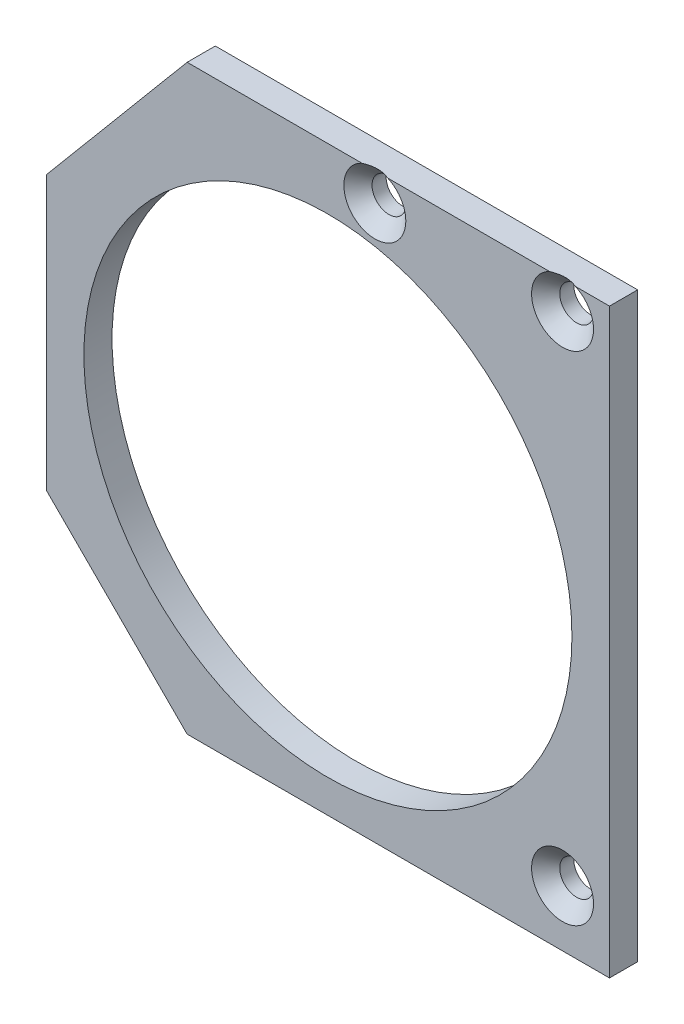
ISO-10303-21;
HEADER;
FILE_DESCRIPTION(('STEP AP214'),'2;1');
FILE_NAME('part.step','',(''),(''),'','','');
FILE_SCHEMA(('AUTOMOTIVE_DESIGN { 1 0 10303 214 1 1 1 1 }'));
ENDSEC;
DATA;
#1=APPLICATION_CONTEXT('core data for automotive mechanical design processes');
#2=APPLICATION_PROTOCOL_DEFINITION('international standard','automotive_design',2000,#1);
#3=PRODUCT_CONTEXT('',#1,'mechanical');
#4=PRODUCT('Part','Part','',(#3));
#5=PRODUCT_RELATED_PRODUCT_CATEGORY('part','',(#4));
#6=PRODUCT_DEFINITION_FORMATION('','',#4);
#7=PRODUCT_DEFINITION_CONTEXT('part definition',#1,'design');
#8=PRODUCT_DEFINITION('design','',#6,#7);
#9=PRODUCT_DEFINITION_SHAPE('','',#8);
#10=(LENGTH_UNIT() NAMED_UNIT(*) SI_UNIT(.MILLI.,.METRE.));
#11=(NAMED_UNIT(*) PLANE_ANGLE_UNIT() SI_UNIT($,.RADIAN.));
#12=(NAMED_UNIT(*) SI_UNIT($,.STERADIAN.) SOLID_ANGLE_UNIT());
#13=UNCERTAINTY_MEASURE_WITH_UNIT(LENGTH_MEASURE(1.E-05),#10,'distance_accuracy_value','');
#14=(GEOMETRIC_REPRESENTATION_CONTEXT(3) GLOBAL_UNCERTAINTY_ASSIGNED_CONTEXT((#13)) GLOBAL_UNIT_ASSIGNED_CONTEXT((#10,
#11,#12)) REPRESENTATION_CONTEXT('',''));
#15=CARTESIAN_POINT('',(0.,0.,0.));
#16=DIRECTION('',(0.,0.,1.));
#17=DIRECTION('',(1.,0.,0.));
#18=AXIS2_PLACEMENT_3D('',#15,#16,#17);
#19=CARTESIAN_POINT('',(0.,0.,3.));
#20=DIRECTION('',(0.,0.,1.));
#21=DIRECTION('',(1.,0.,0.));
#22=AXIS2_PLACEMENT_3D('',#19,#20,#21);
#23=PLANE('',#22);
#24=CARTESIAN_POINT('',(5.,28.,3.));
#25=DIRECTION('',(0.,0.,1.));
#26=DIRECTION('',(1.,0.,0.));
#27=AXIS2_PLACEMENT_3D('',#24,#25,#26);
#28=CIRCLE('',#27,3.3);
#29=CARTESIAN_POINT('',(3.62522729151325,31.,3.));
#30=VERTEX_POINT('',#29);
#31=CARTESIAN_POINT('',(6.37477270848674,31.,3.));
#32=VERTEX_POINT('',#31);
#33=EDGE_CURVE('E54',#30,#32,#28,.T.);
#34=ORIENTED_EDGE('',*,*,#33,.F.);
#35=DIRECTION('',(-1.,0.,0.));
#36=VECTOR('',#35,1.);
#37=CARTESIAN_POINT('',(-30.,31.,3.));
#38=LINE('',#37,#36);
#39=CARTESIAN_POINT('',(-15.,31.,3.));
#40=VERTEX_POINT('',#39);
#41=EDGE_CURVE('E109',#30,#40,#38,.T.);
#42=ORIENTED_EDGE('',*,*,#41,.T.);
#43=DIRECTION('',(0.642787609686543,0.766044443118975,0.));
#44=VECTOR('',#43,1.);
#45=CARTESIAN_POINT('',(-30.,13.123696111087,3.));
#46=LINE('',#45,#44);
#47=CARTESIAN_POINT('',(-30.,13.123696111087,3.));
#48=VERTEX_POINT('',#47);
#49=EDGE_CURVE('E226',#48,#40,#46,.T.);
#50=ORIENTED_EDGE('',*,*,#49,.F.);
#51=DIRECTION('',(0.,-1.,0.));
#52=VECTOR('',#51,1.);
#53=CARTESIAN_POINT('',(-30.,31.,3.));
#54=LINE('',#53,#52);
#55=CARTESIAN_POINT('',(-30.,-16.,3.));
#56=VERTEX_POINT('',#55);
#57=EDGE_CURVE('E126',#48,#56,#54,.T.);
#58=ORIENTED_EDGE('',*,*,#57,.T.);
#59=DIRECTION('',(-0.707106781186548,0.707106781186547,0.));
#60=VECTOR('',#59,1.);
#61=CARTESIAN_POINT('',(-30.,-16.,3.));
#62=LINE('',#61,#60);
#63=CARTESIAN_POINT('',(-15.,-31.,3.));
#64=VERTEX_POINT('',#63);
#65=EDGE_CURVE('E215',#64,#56,#62,.T.);
#66=ORIENTED_EDGE('',*,*,#65,.F.);
#67=DIRECTION('',(1.,0.,0.));
#68=VECTOR('',#67,1.);
#69=CARTESIAN_POINT('',(-30.,-31.,3.));
#70=LINE('',#69,#68);
#71=CARTESIAN_POINT('',(30.,-31.,3.));
#72=VERTEX_POINT('',#71);
#73=EDGE_CURVE('E128',#64,#72,#70,.T.);
#74=ORIENTED_EDGE('',*,*,#73,.T.);
#75=DIRECTION('',(0.,1.,0.));
#76=VECTOR('',#75,1.);
#77=CARTESIAN_POINT('',(30.,31.,3.));
#78=LINE('',#77,#76);
#79=CARTESIAN_POINT('',(30.,31.,3.));
#80=VERTEX_POINT('',#79);
#81=EDGE_CURVE('E118',#72,#80,#78,.T.);
#82=ORIENTED_EDGE('',*,*,#81,.T.);
#83=CARTESIAN_POINT('',(26.3747727084867,31.,3.));
#84=VERTEX_POINT('',#83);
#85=EDGE_CURVE('E120',#80,#84,#38,.T.);
#86=ORIENTED_EDGE('',*,*,#85,.T.);
#87=CARTESIAN_POINT('',(25.,28.,3.));
#88=DIRECTION('',(0.,0.,1.));
#89=DIRECTION('',(1.,0.,0.));
#90=AXIS2_PLACEMENT_3D('',#87,#88,#89);
#91=CIRCLE('',#90,3.3);
#92=CARTESIAN_POINT('',(23.6252272915132,31.,3.));
#93=VERTEX_POINT('',#92);
#94=EDGE_CURVE('E60',#93,#84,#91,.T.);
#95=ORIENTED_EDGE('',*,*,#94,.F.);
#96=EDGE_CURVE('E111',#93,#32,#38,.T.);
#97=ORIENTED_EDGE('',*,*,#96,.T.);
#98=EDGE_LOOP('',(#34,#42,#50,#58,#66,#74,#82,#86,#95,#97));
#99=FACE_BOUND('',#98,.T.);
#100=CARTESIAN_POINT('',(25.,-25.,3.));
#101=DIRECTION('',(0.,0.,1.));
#102=DIRECTION('',(1.,0.,0.));
#103=AXIS2_PLACEMENT_3D('',#100,#101,#102);
#104=CIRCLE('',#103,3.3);
#105=CARTESIAN_POINT('',(28.3,-25.,3.));
#106=VERTEX_POINT('',#105);
#107=EDGE_CURVE('E257',#106,#106,#104,.T.);
#108=ORIENTED_EDGE('',*,*,#107,.F.);
#109=EDGE_LOOP('',(#108));
#110=FACE_BOUND('',#109,.T.);
#111=CARTESIAN_POINT('',(0.,-1.49999999999999,3.));
#112=DIRECTION('',(0.,0.,1.));
#113=DIRECTION('',(1.,0.,0.));
#114=AXIS2_PLACEMENT_3D('',#111,#112,#113);
#115=CIRCLE('',#114,26.);
#116=CARTESIAN_POINT('',(26.,-1.49999999999999,3.));
#117=VERTEX_POINT('',#116);
#118=EDGE_CURVE('E138',#117,#117,#115,.T.);
#119=ORIENTED_EDGE('',*,*,#118,.F.);
#120=EDGE_LOOP('',(#119));
#121=FACE_BOUND('',#120,.T.);
#122=ADVANCED_FACE('F35',(#99,#110,#121),#23,.T.);
#123=CARTESIAN_POINT('',(0.,0.,0.));
#124=DIRECTION('',(0.,0.,1.));
#125=DIRECTION('',(1.,0.,0.));
#126=AXIS2_PLACEMENT_3D('',#123,#124,#125);
#127=PLANE('',#126);
#128=CARTESIAN_POINT('',(5.,28.,0.));
#129=DIRECTION('',(0.,0.,1.));
#130=DIRECTION('',(1.,0.,0.));
#131=AXIS2_PLACEMENT_3D('',#128,#129,#130);
#132=CIRCLE('',#131,1.79999999999999);
#133=CARTESIAN_POINT('',(6.79999999999998,28.,0.));
#134=VERTEX_POINT('',#133);
#135=EDGE_CURVE('E246',#134,#134,#132,.T.);
#136=ORIENTED_EDGE('',*,*,#135,.T.);
#137=EDGE_LOOP('',(#136));
#138=FACE_BOUND('',#137,.T.);
#139=CARTESIAN_POINT('',(25.,28.,0.));
#140=DIRECTION('',(0.,0.,1.));
#141=DIRECTION('',(1.,0.,0.));
#142=AXIS2_PLACEMENT_3D('',#139,#140,#141);
#143=CIRCLE('',#142,1.79999999999999);
#144=CARTESIAN_POINT('',(26.8,28.,0.));
#145=VERTEX_POINT('',#144);
#146=EDGE_CURVE('E249',#145,#145,#143,.T.);
#147=ORIENTED_EDGE('',*,*,#146,.T.);
#148=EDGE_LOOP('',(#147));
#149=FACE_BOUND('',#148,.T.);
#150=CARTESIAN_POINT('',(25.,-25.,0.));
#151=DIRECTION('',(0.,0.,1.));
#152=DIRECTION('',(1.,0.,0.));
#153=AXIS2_PLACEMENT_3D('',#150,#151,#152);
#154=CIRCLE('',#153,1.79999999999999);
#155=CARTESIAN_POINT('',(26.8,-25.,0.));
#156=VERTEX_POINT('',#155);
#157=EDGE_CURVE('E216',#156,#156,#154,.T.);
#158=ORIENTED_EDGE('',*,*,#157,.T.);
#159=EDGE_LOOP('',(#158));
#160=FACE_BOUND('',#159,.T.);
#161=DIRECTION('',(1.,0.,0.));
#162=VECTOR('',#161,1.);
#163=CARTESIAN_POINT('',(-30.,-31.,0.));
#164=LINE('',#163,#162);
#165=CARTESIAN_POINT('',(-15.,-31.,0.));
#166=VERTEX_POINT('',#165);
#167=CARTESIAN_POINT('',(30.,-31.,0.));
#168=VERTEX_POINT('',#167);
#169=EDGE_CURVE('E122',#166,#168,#164,.T.);
#170=ORIENTED_EDGE('',*,*,#169,.F.);
#171=DIRECTION('',(0.707106781186548,-0.707106781186547,0.));
#172=VECTOR('',#171,1.);
#173=CARTESIAN_POINT('',(-30.,-16.,0.));
#174=LINE('',#173,#172);
#175=CARTESIAN_POINT('',(-30.,-16.,0.));
#176=VERTEX_POINT('',#175);
#177=EDGE_CURVE('E212',#176,#166,#174,.T.);
#178=ORIENTED_EDGE('',*,*,#177,.F.);
#179=DIRECTION('',(0.,-1.,0.));
#180=VECTOR('',#179,1.);
#181=CARTESIAN_POINT('',(-30.,31.,0.));
#182=LINE('',#181,#180);
#183=CARTESIAN_POINT('',(-30.,13.1236961110871,0.));
#184=VERTEX_POINT('',#183);
#185=EDGE_CURVE('E140',#184,#176,#182,.T.);
#186=ORIENTED_EDGE('',*,*,#185,.F.);
#187=DIRECTION('',(0.642787609686543,0.766044443118975,0.));
#188=VECTOR('',#187,1.);
#189=CARTESIAN_POINT('',(-30.,13.123696111087,0.));
#190=LINE('',#189,#188);
#191=CARTESIAN_POINT('',(-15.,31.,0.));
#192=VERTEX_POINT('',#191);
#193=EDGE_CURVE('E211',#184,#192,#190,.T.);
#194=ORIENTED_EDGE('',*,*,#193,.T.);
#195=DIRECTION('',(-1.,0.,0.));
#196=VECTOR('',#195,1.);
#197=CARTESIAN_POINT('',(-30.,31.,0.));
#198=LINE('',#197,#196);
#199=CARTESIAN_POINT('',(30.,31.,0.));
#200=VERTEX_POINT('',#199);
#201=EDGE_CURVE('E137',#200,#192,#198,.T.);
#202=ORIENTED_EDGE('',*,*,#201,.F.);
#203=DIRECTION('',(0.,1.,0.));
#204=VECTOR('',#203,1.);
#205=CARTESIAN_POINT('',(30.,31.,0.));
#206=LINE('',#205,#204);
#207=EDGE_CURVE('E134',#168,#200,#206,.T.);
#208=ORIENTED_EDGE('',*,*,#207,.F.);
#209=EDGE_LOOP('',(#170,#178,#186,#194,#202,#208));
#210=FACE_BOUND('',#209,.T.);
#211=CARTESIAN_POINT('',(0.,-1.49999999999999,0.));
#212=DIRECTION('',(0.,0.,1.));
#213=DIRECTION('',(1.,0.,0.));
#214=AXIS2_PLACEMENT_3D('',#211,#212,#213);
#215=CIRCLE('',#214,26.);
#216=CARTESIAN_POINT('',(26.,-1.49999999999999,0.));
#217=VERTEX_POINT('',#216);
#218=EDGE_CURVE('E231',#217,#217,#215,.T.);
#219=ORIENTED_EDGE('',*,*,#218,.T.);
#220=EDGE_LOOP('',(#219));
#221=FACE_BOUND('',#220,.T.);
#222=ADVANCED_FACE('F189',(#138,#149,#160,#210,#221),#127,.F.);
#223=CARTESIAN_POINT('',(30.,31.,3.));
#224=DIRECTION('',(-1.,0.,0.));
#225=DIRECTION('',(0.,-1.,0.));
#226=AXIS2_PLACEMENT_3D('',#223,#224,#225);
#227=PLANE('',#226);
#228=ORIENTED_EDGE('',*,*,#207,.T.);
#229=DIRECTION('',(0.,0.,-1.));
#230=VECTOR('',#229,1.);
#231=CARTESIAN_POINT('',(30.,31.,3.));
#232=LINE('',#231,#230);
#233=EDGE_CURVE('E146',#80,#200,#232,.T.);
#234=ORIENTED_EDGE('',*,*,#233,.F.);
#235=ORIENTED_EDGE('',*,*,#81,.F.);
#236=DIRECTION('',(0.,0.,-1.));
#237=VECTOR('',#236,1.);
#238=CARTESIAN_POINT('',(30.,-31.,3.));
#239=LINE('',#238,#237);
#240=EDGE_CURVE('E131',#72,#168,#239,.T.);
#241=ORIENTED_EDGE('',*,*,#240,.T.);
#242=EDGE_LOOP('',(#228,#234,#235,#241));
#243=FACE_BOUND('',#242,.T.);
#244=ADVANCED_FACE('F37',(#243),#227,.F.);
#245=CARTESIAN_POINT('',(-30.,31.,3.));
#246=DIRECTION('',(0.,-1.,0.));
#247=DIRECTION('',(1.,0.,0.));
#248=AXIS2_PLACEMENT_3D('',#245,#246,#247);
#249=PLANE('',#248);
#250=ORIENTED_EDGE('',*,*,#41,.F.);
#251=CARTESIAN_POINT('',(-6.45285562091003,31.,11.5392525893069));
#252=CARTESIAN_POINT('',(-6.15275280096645,31.,11.2489705564499));
#253=CARTESIAN_POINT('',(-5.85230826613524,31.,10.9590402435186));
#254=CARTESIAN_POINT('',(-5.25046594745898,31.,10.3801274588995));
#255=CARTESIAN_POINT('',(-4.94906809641479,31.,10.0911450570927));
#256=CARTESIAN_POINT('',(-4.34411816871667,31.,9.51348402377807));
#257=CARTESIAN_POINT('',(-4.0405622790841,31.,9.22480938090818));
#258=CARTESIAN_POINT('',(-3.43189572732243,31.,8.64913954129913));
#259=CARTESIAN_POINT('',(-3.12678515838647,31.,8.36214424605875));
#260=CARTESIAN_POINT('',(-2.47604575622062,31.,7.75455733783873));
#261=CARTESIAN_POINT('',(-2.13013481535182,31.,7.43426682781041));
#262=CARTESIAN_POINT('',(-1.60827810880776,31.,6.9570276335175));
#263=CARTESIAN_POINT('',(-1.43380929737719,31.,6.79846443498906));
#264=CARTESIAN_POINT('',(-1.08364581976484,31.,6.48269843451918));
#265=CARTESIAN_POINT('',(-0.907951163454536,31.,6.32549562164562));
#266=CARTESIAN_POINT('',(-0.555350550124874,31.,6.01310114000117));
#267=CARTESIAN_POINT('',(-0.378447376350146,31.,5.85790633422817));
#268=CARTESIAN_POINT('',(-0.0227042299990999,31.,5.54975600019851));
#269=CARTESIAN_POINT('',(0.156135693454553,31.,5.39680041537781));
#270=CARTESIAN_POINT('',(0.516269211865739,31.,5.09391778739342));
#271=CARTESIAN_POINT('',(0.697561999084173,31.,4.94398978590895));
#272=CARTESIAN_POINT('',(1.06344020965596,31.,4.64821726682396));
#273=CARTESIAN_POINT('',(1.24802527339892,31.,4.50237230765669));
#274=CARTESIAN_POINT('',(1.52972989454971,31.,4.2868370848864));
#275=CARTESIAN_POINT('',(1.62519589360843,31.,4.21498623668784));
#276=CARTESIAN_POINT('',(1.81748884817212,31.,4.07311723883915));
#277=CARTESIAN_POINT('',(1.91431584877888,31.,4.00309915014535));
#278=CARTESIAN_POINT('',(2.10969565735157,31.,3.86522054567184));
#279=CARTESIAN_POINT('',(2.2082506281213,31.,3.79736308534592));
#280=CARTESIAN_POINT('',(2.4072398057213,31.,3.66445701107809));
#281=CARTESIAN_POINT('',(2.50767394876529,31.,3.59940830204345));
#282=CARTESIAN_POINT('',(2.70917466453786,31.,3.47382672056162));
#283=CARTESIAN_POINT('',(2.81020708872216,31.,3.41323933653267));
#284=CARTESIAN_POINT('',(3.01478569658213,31.,3.29639028753415));
#285=CARTESIAN_POINT('',(3.11833233536457,31.,3.24012941351836));
#286=CARTESIAN_POINT('',(3.32804567184936,31.,3.13326497029052));
#287=CARTESIAN_POINT('',(3.43420618126775,31.,3.08264936291488));
#288=CARTESIAN_POINT('',(3.64959428416185,31.,2.98849894263039));
#289=CARTESIAN_POINT('',(3.75882005280797,31.,2.94496001742076));
#290=CARTESIAN_POINT('',(3.96288386636742,31.,2.87301162910838));
#291=CARTESIAN_POINT('',(4.05725814357774,31.,2.84329792728081));
#292=CARTESIAN_POINT('',(4.24808850573965,31.,2.79143141529014));
#293=CARTESIAN_POINT('',(4.34454447022943,31.,2.76927816886395));
#294=CARTESIAN_POINT('',(4.53849244850556,31.,2.73380351853377));
#295=CARTESIAN_POINT('',(4.63597471657368,31.,2.72042969873719));
#296=CARTESIAN_POINT('',(4.83178132564498,31.,2.70313101140363));
#297=CARTESIAN_POINT('',(4.93010558051452,31.,2.69920518867395));
#298=CARTESIAN_POINT('',(5.12387789015899,31.,2.70103703197444));
#299=CARTESIAN_POINT('',(5.21932865604651,31.,2.70652401622056));
#300=CARTESIAN_POINT('',(5.40930119294473,31.,2.72631739444189));
#301=CARTESIAN_POINT('',(5.5038229086731,31.,2.74062431005036));
#302=CARTESIAN_POINT('',(5.69182904947561,31.,2.77734783887106));
#303=CARTESIAN_POINT('',(5.78530412552614,31.,2.79981157488035));
#304=CARTESIAN_POINT('',(5.97026650730137,31.,2.85175048939282));
#305=CARTESIAN_POINT('',(6.06175362698041,31.,2.88122632107479));
#306=CARTESIAN_POINT('',(6.25293509576115,31.,2.94976812217862));
#307=CARTESIAN_POINT('',(6.35237221303947,31.,2.98954517684306));
#308=CARTESIAN_POINT('',(6.54868558191355,31.,3.07499804277696));
#309=CARTESIAN_POINT('',(6.64556099817013,31.,3.12067575028482));
#310=CARTESIAN_POINT('',(6.83709403208135,31.,3.21682279310862));
#311=CARTESIAN_POINT('',(6.93174755246815,31.,3.26730022772952));
#312=CARTESIAN_POINT('',(7.11891063104755,31.,3.37202513575827));
#313=CARTESIAN_POINT('',(7.21142055098155,31.,3.42627196679478));
#314=CARTESIAN_POINT('',(7.39581663375493,31.,3.53855675187773));
#315=CARTESIAN_POINT('',(7.48767754889119,31.,3.59663597502819));
#316=CARTESIAN_POINT('',(7.66974969537282,31.,3.71532053259731));
#317=CARTESIAN_POINT('',(7.75996088316641,31.,3.77592593356741));
#318=CARTESIAN_POINT('',(7.93886696188889,31.,3.89913532308982));
#319=CARTESIAN_POINT('',(8.02756331764609,31.,3.96173719079936));
#320=CARTESIAN_POINT('',(8.20372561564267,31.,4.08863631341683));
#321=CARTESIAN_POINT('',(8.29119161263785,31.,4.15293349250833));
#322=CARTESIAN_POINT('',(8.49205855628277,31.,4.3031228892681));
#323=CARTESIAN_POINT('',(8.60508027357718,31.,4.3895218387513));
#324=CARTESIAN_POINT('',(8.82961696308996,31.,4.56425872194153));
#325=CARTESIAN_POINT('',(8.94113187319301,31.,4.65259673519131));
#326=CARTESIAN_POINT('',(9.27383218131246,31.,4.91997324078732));
#327=CARTESIAN_POINT('',(9.4931390107006,31.,5.10134830082653));
#328=CARTESIAN_POINT('',(9.92830108560637,31.,5.46841148085376));
#329=CARTESIAN_POINT('',(10.1441542950753,31.,5.65410199746505));
#330=CARTESIAN_POINT('',(10.5732323703512,31.,6.02850265024441));
#331=CARTESIAN_POINT('',(10.7864571564436,31.,6.21721287759717));
#332=CARTESIAN_POINT('',(11.2114439458873,31.,6.59731770915798));
#333=CARTESIAN_POINT('',(11.4232010412092,31.,6.78871778835942));
#334=CARTESIAN_POINT('',(11.8451760109497,31.,7.17321304512812));
#335=CARTESIAN_POINT('',(12.0553938557021,31.,7.36630825520907));
#336=CARTESIAN_POINT('',(12.6840972883393,31.,7.94739647461864));
#337=CARTESIAN_POINT('',(13.1007871228247,31.,8.33733123303791));
#338=CARTESIAN_POINT('',(13.8763539854604,31.,9.06886007099785));
#339=CARTESIAN_POINT('',(14.2356121269083,31.,9.41005159719586));
#340=CARTESIAN_POINT('',(14.9524747781457,31.,10.0942434429225));
#341=CARTESIAN_POINT('',(15.3100791074474,31.,10.4372439515201));
#342=CARTESIAN_POINT('',(16.0225070550545,31.,11.1230636357184));
#343=CARTESIAN_POINT('',(16.3773360198599,31.,11.4658772635853));
#344=CARTESIAN_POINT('',(17.0859904933709,31.,12.1524565146784));
#345=CARTESIAN_POINT('',(17.4398161159651,31.,12.4962220203226));
#346=CARTESIAN_POINT('',(17.7932987664917,31.,12.8403384023669));
#347=B_SPLINE_CURVE_WITH_KNOTS('',3,(#251,#252,#253,#254,#255,#256,#257,#258,#259,#260,#261,
#262,#263,#264,#265,#266,#267,#268,#269,#270,#271,#272,#273,#274,#275,#276,#277,#278,#279,#280,
#281,#282,#283,#284,#285,#286,#287,#288,#289,#290,#291,#292,#293,#294,#295,#296,#297,#298,#299,
#300,#301,#302,#303,#304,#305,#306,#307,#308,#309,#310,#311,#312,#313,#314,#315,#316,#317,#318,
#319,#320,#321,#322,#323,#324,#325,#326,#327,#328,#329,#330,#331,#332,#333,#334,#335,#336,#337,
#338,#339,#340,#341,#342,#343,#344,#345,#346),.UNSPECIFIED.,.F.,.F.,(4,2,2,2,2,2,2,2,2,2,2,2,2,
2,2,2,2,2,2,2,2,2,2,2,2,2,2,2,2,2,2,2,2,2,2,2,2,2,2,2,2,2,2,2,2,2,2,4),(0.,1.25256994649439,
2.50523024695386,3.76193233037848,5.01855994851695,6.43280252472181,7.14007007993828,
7.84733194623132,8.55330785474532,9.25926589901363,9.96499686827429,10.670651218038,
11.029084750072,11.3875301882533,11.7464618372692,12.1053813247965,12.4587168401826,
12.8121167980263,13.1647481321978,13.517173811928,13.8137361059115,14.1102812843827,
14.4050394936158,14.6997679015359,14.9861622488466,15.2725735358755,15.5606664843067,
15.8487862791968,16.169840107181,16.4909973671401,16.8127065212918,17.1343609843823,
17.4603543863033,17.7863563818625,18.112022902227,18.4376748830034,18.8644350633255,
19.2912127827006,20.1448967386463,20.9990666932001,21.8532624895523,22.7095661438049,
23.565886258547,25.2779030814586,26.7642696554903,28.2507947864948,29.7309357114445,
31.2109013016707),.UNSPECIFIED.);
#348=EDGE_CURVE('E11',#30,#32,#347,.T.);
#349=ORIENTED_EDGE('',*,*,#348,.T.);
#350=ORIENTED_EDGE('',*,*,#96,.F.);
#351=CARTESIAN_POINT('',(13.5471443722589,31.,11.539252595915));
#352=CARTESIAN_POINT('',(13.8472471924448,31.,11.2489705628125));
#353=CARTESIAN_POINT('',(14.1476917275184,31.,10.9590402496355));
#354=CARTESIAN_POINT('',(14.7495340466794,31.,10.3801274645251));
#355=CARTESIAN_POINT('',(15.050931897966,31.,10.0911450624727));
#356=CARTESIAN_POINT('',(15.6558818261502,31.,9.51348402866545));
#357=CARTESIAN_POINT('',(15.9594377160265,31.,9.22480938554867));
#358=CARTESIAN_POINT('',(16.5681042682759,31.,8.64913954544605));
#359=CARTESIAN_POINT('',(16.8732148374558,31.,8.36214424995901));
#360=CARTESIAN_POINT('',(17.5239542401619,31.,7.7545573411956));
#361=CARTESIAN_POINT('',(17.8698651813271,31.,7.4342668308708));
#362=CARTESIAN_POINT('',(18.3917218883177,31.,6.95702763613474));
#363=CARTESIAN_POINT('',(18.5661906998975,31.,6.79846443745881));
#364=CARTESIAN_POINT('',(18.916354177809,31.,6.48269843669481));
#365=CARTESIAN_POINT('',(19.0920488342694,31.,6.32549562367462));
#366=CARTESIAN_POINT('',(19.4446494479,31.,6.01310114173867));
#367=CARTESIAN_POINT('',(19.6215526218255,31.,5.8579063358208));
#368=CARTESIAN_POINT('',(19.9772957684802,31.,5.54975600150341));
#369=CARTESIAN_POINT('',(20.1561356920866,31.,5.39680041653985));
#370=CARTESIAN_POINT('',(20.5162692108061,31.,5.09391778827311));
#371=CARTESIAN_POINT('',(20.69756199818,31.,4.94398978664913));
#372=CARTESIAN_POINT('',(21.0634402090674,31.,4.64821726729043));
#373=CARTESIAN_POINT('',(21.2480252729704,31.,4.50237230798897));
#374=CARTESIAN_POINT('',(21.529729894284,31.,4.2868370850875));
#375=CARTESIAN_POINT('',(21.6251958933418,31.,4.21498623688721));
#376=CARTESIAN_POINT('',(21.8174888479034,31.,4.07311723903473));
#377=CARTESIAN_POINT('',(21.9143158485091,31.,4.00309915033888));
#378=CARTESIAN_POINT('',(22.1096956570793,31.,3.86522054586085));
#379=CARTESIAN_POINT('',(22.2082506278476,31.,3.79736308553246));
#380=CARTESIAN_POINT('',(22.4072398054446,31.,3.66445701125913));
#381=CARTESIAN_POINT('',(22.5076739484869,31.,3.59940830222146));
#382=CARTESIAN_POINT('',(22.7091746642564,31.,3.47382672073256));
#383=CARTESIAN_POINT('',(22.8102070884393,31.,3.41323933669961));
#384=CARTESIAN_POINT('',(23.0147856962961,31.,3.29639028769216));
#385=CARTESIAN_POINT('',(23.1183323350768,31.,3.24012941367145));
#386=CARTESIAN_POINT('',(23.3280456715579,31.,3.13326497043259));
#387=CARTESIAN_POINT('',(23.4342061809744,31.,3.08264936305083));
#388=CARTESIAN_POINT('',(23.6495942838645,31.,2.98849894275266));
#389=CARTESIAN_POINT('',(23.7588200525086,31.,2.94496001753545));
#390=CARTESIAN_POINT('',(23.9628838660424,31.,2.87301162921531));
#391=CARTESIAN_POINT('',(24.0572581432286,31.,2.8432979273863));
#392=CARTESIAN_POINT('',(24.2480885053417,31.,2.79143141538771));
#393=CARTESIAN_POINT('',(24.3445444698068,31.,2.76927816895503));
#394=CARTESIAN_POINT('',(24.5384924480344,31.,2.73380351860627));
#395=CARTESIAN_POINT('',(24.6359747160786,31.,2.72042969879766));
#396=CARTESIAN_POINT('',(24.8317813251032,31.,2.70313101143478));
#397=CARTESIAN_POINT('',(24.93010557995,31.,2.69920518868781));
#398=CARTESIAN_POINT('',(25.1238778895454,31.,2.70103703194998));
#399=CARTESIAN_POINT('',(25.2193286554067,31.,2.7065240161746));
#400=CARTESIAN_POINT('',(25.4093011922547,31.,2.72631739434928));
#401=CARTESIAN_POINT('',(25.5038229079591,31.,2.74062430993259));
#402=CARTESIAN_POINT('',(25.691829048715,31.,2.77734783870063));
#403=CARTESIAN_POINT('',(25.7853041247429,31.,2.79981157468235));
#404=CARTESIAN_POINT('',(25.9702665064749,31.,2.85175048913881));
#405=CARTESIAN_POINT('',(26.0617536261333,31.,2.88122632079235));
#406=CARTESIAN_POINT('',(26.2529350948154,31.,2.94976812181585));
#407=CARTESIAN_POINT('',(26.3523722120173,31.,2.98954517642428));
#408=CARTESIAN_POINT('',(26.5486855807423,31.,3.07499804224095));
#409=CARTESIAN_POINT('',(26.6455609969263,31.,3.12067574968757));
#410=CARTESIAN_POINT('',(26.837094030695,31.,3.2168227923855));
#411=CARTESIAN_POINT('',(26.9317475510119,31.,3.26730022694176));
#412=CARTESIAN_POINT('',(27.1189106294536,31.,3.37202513483932));
#413=CARTESIAN_POINT('',(27.2114205493199,31.,3.4262719658093));
#414=CARTESIAN_POINT('',(27.3958166319593,31.,3.53855675075762));
#415=CARTESIAN_POINT('',(27.4876775470293,31.,3.59663597384001));
#416=CARTESIAN_POINT('',(27.6697496933794,31.,3.71532053127241));
#417=CARTESIAN_POINT('',(27.7599608811078,31.,3.77592593217386));
#418=CARTESIAN_POINT('',(27.9388669597009,31.,3.89913532155885));
#419=CARTESIAN_POINT('',(28.0275633153938,31.,3.96173718919962));
#420=CARTESIAN_POINT('',(28.2037256132623,31.,4.08863631167946));
#421=CARTESIAN_POINT('',(28.2911916101937,31.,4.15293349070212));
#422=CARTESIAN_POINT('',(28.4920585538005,31.,4.30312288738416));
#423=CARTESIAN_POINT('',(28.6050802711188,31.,4.38952183686079));
#424=CARTESIAN_POINT('',(28.8296169606772,31.,4.56425872004136));
#425=CARTESIAN_POINT('',(28.9411318708019,31.,4.65259673328804));
#426=CARTESIAN_POINT('',(29.2738321789837,31.,4.91997323887873));
#427=CARTESIAN_POINT('',(29.4931390084098,31.,5.1013482989196));
#428=CARTESIAN_POINT('',(29.9283010833871,31.,5.46841147895655));
#429=CARTESIAN_POINT('',(30.1441542928897,31.,5.65410199557593));
#430=CARTESIAN_POINT('',(30.5732323682298,31.,6.02850264837536));
#431=CARTESIAN_POINT('',(30.7864571543526,31.,6.21721287574012));
#432=CARTESIAN_POINT('',(31.2114439438565,31.,6.59731770732852));
#433=CARTESIAN_POINT('',(31.4232010392079,31.,6.78871778654558));
#434=CARTESIAN_POINT('',(31.8451760090059,31.,7.17321304334732));
#435=CARTESIAN_POINT('',(32.0553938537864,31.,7.36630825344569));
#436=CARTESIAN_POINT('',(32.6840972865054,31.,7.9473964729089));
#437=CARTESIAN_POINT('',(33.1007871210431,31.,8.33733123136624));
#438=CARTESIAN_POINT('',(33.8763539837001,31.,9.06886006932993));
#439=CARTESIAN_POINT('',(34.2356121251178,31.,9.4100515954928));
#440=CARTESIAN_POINT('',(34.9524747762946,31.,10.0942434411499));
#441=CARTESIAN_POINT('',(35.3100791055656,31.,10.4372439497131));
#442=CARTESIAN_POINT('',(36.022507053108,31.,11.12306363384));
#443=CARTESIAN_POINT('',(36.3773360178791,31.,11.4658772616699));
#444=CARTESIAN_POINT('',(37.0859904913213,31.,12.1524565126892));
#445=CARTESIAN_POINT('',(37.4398161138809,31.,12.4962220182965));
#446=CARTESIAN_POINT('',(37.7932987643729,31.,12.840338400304));
#447=B_SPLINE_CURVE_WITH_KNOTS('',3,(#351,#352,#353,#354,#355,#356,#357,#358,#359,#360,#361,
#362,#363,#364,#365,#366,#367,#368,#369,#370,#371,#372,#373,#374,#375,#376,#377,#378,#379,#380,
#381,#382,#383,#384,#385,#386,#387,#388,#389,#390,#391,#392,#393,#394,#395,#396,#397,#398,#399,
#400,#401,#402,#403,#404,#405,#406,#407,#408,#409,#410,#411,#412,#413,#414,#415,#416,#417,#418,
#419,#420,#421,#422,#423,#424,#425,#426,#427,#428,#429,#430,#431,#432,#433,#434,#435,#436,#437,
#438,#439,#440,#441,#442,#443,#444,#445,#446),.UNSPECIFIED.,.F.,.F.,(4,2,2,2,2,2,2,2,2,2,2,2,2,
2,2,2,2,2,2,2,2,2,2,2,2,2,2,2,2,2,2,2,2,2,2,2,2,2,2,2,2,2,2,2,2,2,2,4),(0.,1.2525699475292,
2.50523024902365,3.76193233348859,5.01855995266719,6.43280253012897,7.14007008597422,
7.84733195289603,8.55330786203684,9.25926590693193,9.96499687681885,10.6706512272086,
11.0290847592436,11.3875301974258,11.7464618464424,12.1053813339706,12.4587168493592,
12.8121168072055,13.1647481413797,13.5171738211126,13.8137361150288,14.1102812934326,
14.4050395025999,14.6997679104541,14.9861622576828,15.2725735446295,15.5606664929755,
15.8487862877805,16.1698401154897,16.4909973751737,16.8127065290491,17.1343609918634,
17.4603543935072,17.7863563887892,18.1120229088771,18.4376748893771,18.8644350697442,
19.2912127891644,20.1448967452007,20.9990666998468,21.8532624962913,22.7095661506411,
23.5658862654804,25.2779030885844,26.764269662478,28.2507947933447,29.7309357181435,
31.2109013082183),.UNSPECIFIED.);
#448=EDGE_CURVE('E48',#93,#84,#447,.T.);
#449=ORIENTED_EDGE('',*,*,#448,.T.);
#450=ORIENTED_EDGE('',*,*,#85,.F.);
#451=ORIENTED_EDGE('',*,*,#233,.T.);
#452=ORIENTED_EDGE('',*,*,#201,.T.);
#453=DIRECTION('',(0.,0.,1.));
#454=VECTOR('',#453,1.);
#455=CARTESIAN_POINT('',(-15.,31.,0.));
#456=LINE('',#455,#454);
#457=EDGE_CURVE('E117',#192,#40,#456,.T.);
#458=ORIENTED_EDGE('',*,*,#457,.T.);
#459=EDGE_LOOP('',(#250,#349,#350,#449,#450,#451,#452,#458));
#460=FACE_BOUND('',#459,.T.);
#461=ADVANCED_FACE('F115',(#460),#249,.F.);
#462=CARTESIAN_POINT('',(-30.,31.,3.));
#463=DIRECTION('',(1.,0.,0.));
#464=DIRECTION('',(0.,1.,0.));
#465=AXIS2_PLACEMENT_3D('',#462,#463,#464);
#466=PLANE('',#465);
#467=ORIENTED_EDGE('',*,*,#185,.T.);
#468=DIRECTION('',(0.,0.,1.));
#469=VECTOR('',#468,1.);
#470=CARTESIAN_POINT('',(-30.,-16.,-0.00100000000000013));
#471=LINE('',#470,#469);
#472=EDGE_CURVE('E204',#176,#56,#471,.T.);
#473=ORIENTED_EDGE('',*,*,#472,.T.);
#474=ORIENTED_EDGE('',*,*,#57,.F.);
#475=DIRECTION('',(0.,0.,1.));
#476=VECTOR('',#475,1.);
#477=CARTESIAN_POINT('',(-30.,13.123696111087,0.));
#478=LINE('',#477,#476);
#479=EDGE_CURVE('E205',#184,#48,#478,.T.);
#480=ORIENTED_EDGE('',*,*,#479,.F.);
#481=EDGE_LOOP('',(#467,#473,#474,#480));
#482=FACE_BOUND('',#481,.T.);
#483=ADVANCED_FACE('F194',(#482),#466,.F.);
#484=CARTESIAN_POINT('',(-30.,-31.,3.));
#485=DIRECTION('',(0.,1.,0.));
#486=DIRECTION('',(-1.,0.,0.));
#487=AXIS2_PLACEMENT_3D('',#484,#485,#486);
#488=PLANE('',#487);
#489=ORIENTED_EDGE('',*,*,#73,.F.);
#490=DIRECTION('',(0.,0.,1.));
#491=VECTOR('',#490,1.);
#492=CARTESIAN_POINT('',(-15.,-31.,-0.00100000000000013));
#493=LINE('',#492,#491);
#494=EDGE_CURVE('E218',#166,#64,#493,.T.);
#495=ORIENTED_EDGE('',*,*,#494,.F.);
#496=ORIENTED_EDGE('',*,*,#169,.T.);
#497=ORIENTED_EDGE('',*,*,#240,.F.);
#498=EDGE_LOOP('',(#489,#495,#496,#497));
#499=FACE_BOUND('',#498,.T.);
#500=ADVANCED_FACE('F185',(#499),#488,.F.);
#501=CARTESIAN_POINT('',(0.,-1.49999999999999,3.));
#502=DIRECTION('',(0.,0.,-1.));
#503=DIRECTION('',(-1.,0.,0.));
#504=AXIS2_PLACEMENT_3D('',#501,#502,#503);
#505=CYLINDRICAL_SURFACE('',#504,26.);
#506=ORIENTED_EDGE('',*,*,#118,.T.);
#507=EDGE_LOOP('',(#506));
#508=FACE_BOUND('',#507,.T.);
#509=ORIENTED_EDGE('',*,*,#218,.F.);
#510=EDGE_LOOP('',(#509));
#511=FACE_BOUND('',#510,.T.);
#512=ADVANCED_FACE('F181',(#508,#511),#505,.F.);
#513=CARTESIAN_POINT('',(-30.,13.123696111087,0.));
#514=DIRECTION('',(0.766044443118975,-0.642787609686543,0.));
#515=DIRECTION('',(0.642787609686543,0.766044443118975,0.));
#516=AXIS2_PLACEMENT_3D('',#513,#514,#515);
#517=PLANE('',#516);
#518=ORIENTED_EDGE('',*,*,#49,.T.);
#519=ORIENTED_EDGE('',*,*,#457,.F.);
#520=ORIENTED_EDGE('',*,*,#193,.F.);
#521=ORIENTED_EDGE('',*,*,#479,.T.);
#522=EDGE_LOOP('',(#518,#519,#520,#521));
#523=FACE_BOUND('',#522,.T.);
#524=ADVANCED_FACE('F177',(#523),#517,.F.);
#525=CARTESIAN_POINT('',(-30.,-16.,-0.00100000000000013));
#526=DIRECTION('',(0.707106781186547,0.707106781186548,0.));
#527=DIRECTION('',(-0.707106781186548,0.707106781186547,0.));
#528=AXIS2_PLACEMENT_3D('',#525,#526,#527);
#529=PLANE('',#528);
#530=ORIENTED_EDGE('',*,*,#177,.T.);
#531=ORIENTED_EDGE('',*,*,#494,.T.);
#532=ORIENTED_EDGE('',*,*,#65,.T.);
#533=ORIENTED_EDGE('',*,*,#472,.F.);
#534=EDGE_LOOP('',(#530,#531,#532,#533));
#535=FACE_BOUND('',#534,.T.);
#536=ADVANCED_FACE('F173',(#535),#529,.F.);
#537=CARTESIAN_POINT('',(25.,-25.,3.));
#538=DIRECTION('',(0.,0.,1.));
#539=DIRECTION('',(1.,0.,0.));
#540=AXIS2_PLACEMENT_3D('',#537,#538,#539);
#541=CYLINDRICAL_SURFACE('',#540,1.79999999999999);
#542=ORIENTED_EDGE('',*,*,#157,.F.);
#543=EDGE_LOOP('',(#542));
#544=FACE_BOUND('',#543,.T.);
#545=CARTESIAN_POINT('',(25.,-25.,1.5));
#546=DIRECTION('',(0.,0.,1.));
#547=DIRECTION('',(1.,0.,0.));
#548=AXIS2_PLACEMENT_3D('',#545,#546,#547);
#549=CIRCLE('',#548,1.8);
#550=CARTESIAN_POINT('',(26.8,-25.,1.5));
#551=VERTEX_POINT('',#550);
#552=EDGE_CURVE('E221',#551,#551,#549,.T.);
#553=ORIENTED_EDGE('',*,*,#552,.T.);
#554=EDGE_LOOP('',(#553));
#555=FACE_BOUND('',#554,.T.);
#556=ADVANCED_FACE('F169',(#544,#555),#541,.F.);
#557=CARTESIAN_POINT('',(25.,-25.,3.));
#558=DIRECTION('',(0.,0.,1.));
#559=DIRECTION('',(1.,0.,0.));
#560=AXIS2_PLACEMENT_3D('',#557,#558,#559);
#561=CONICAL_SURFACE('',#560,3.3,0.785398163397448);
#562=ORIENTED_EDGE('',*,*,#552,.F.);
#563=EDGE_LOOP('',(#562));
#564=FACE_BOUND('',#563,.T.);
#565=ORIENTED_EDGE('',*,*,#107,.T.);
#566=EDGE_LOOP('',(#565));
#567=FACE_BOUND('',#566,.T.);
#568=ADVANCED_FACE('F161',(#564,#567),#561,.F.);
#569=CARTESIAN_POINT('',(25.,28.,3.));
#570=DIRECTION('',(0.,0.,1.));
#571=DIRECTION('',(1.,0.,0.));
#572=AXIS2_PLACEMENT_3D('',#569,#570,#571);
#573=CONICAL_SURFACE('',#572,3.3,0.785398163397448);
#574=CARTESIAN_POINT('',(25.,28.,1.5));
#575=DIRECTION('',(0.,0.,1.));
#576=DIRECTION('',(1.,0.,0.));
#577=AXIS2_PLACEMENT_3D('',#574,#575,#576);
#578=CIRCLE('',#577,1.8);
#579=CARTESIAN_POINT('',(26.8,28.,1.5));
#580=VERTEX_POINT('',#579);
#581=EDGE_CURVE('E245',#580,#580,#578,.T.);
#582=ORIENTED_EDGE('',*,*,#581,.F.);
#583=EDGE_LOOP('',(#582));
#584=FACE_BOUND('',#583,.T.);
#585=ORIENTED_EDGE('',*,*,#94,.T.);
#586=ORIENTED_EDGE('',*,*,#448,.F.);
#587=EDGE_LOOP('',(#585,#586));
#588=FACE_BOUND('',#587,.T.);
#589=ADVANCED_FACE('F155',(#584,#588),#573,.F.);
#590=CARTESIAN_POINT('',(25.,28.,3.));
#591=DIRECTION('',(0.,0.,1.));
#592=DIRECTION('',(1.,0.,0.));
#593=AXIS2_PLACEMENT_3D('',#590,#591,#592);
#594=CYLINDRICAL_SURFACE('',#593,1.79999999999999);
#595=ORIENTED_EDGE('',*,*,#146,.F.);
#596=EDGE_LOOP('',(#595));
#597=FACE_BOUND('',#596,.T.);
#598=ORIENTED_EDGE('',*,*,#581,.T.);
#599=EDGE_LOOP('',(#598));
#600=FACE_BOUND('',#599,.T.);
#601=ADVANCED_FACE('F160',(#597,#600),#594,.F.);
#602=CARTESIAN_POINT('',(5.,28.,3.));
#603=DIRECTION('',(0.,0.,1.));
#604=DIRECTION('',(1.,0.,0.));
#605=AXIS2_PLACEMENT_3D('',#602,#603,#604);
#606=CONICAL_SURFACE('',#605,3.3,0.785398163397448);
#607=CARTESIAN_POINT('',(5.,28.,1.5));
#608=DIRECTION('',(0.,0.,1.));
#609=DIRECTION('',(1.,0.,0.));
#610=AXIS2_PLACEMENT_3D('',#607,#608,#609);
#611=CIRCLE('',#610,1.8);
#612=CARTESIAN_POINT('',(6.8,28.,1.5));
#613=VERTEX_POINT('',#612);
#614=EDGE_CURVE('E112',#613,#613,#611,.T.);
#615=ORIENTED_EDGE('',*,*,#614,.F.);
#616=EDGE_LOOP('',(#615));
#617=FACE_BOUND('',#616,.T.);
#618=ORIENTED_EDGE('',*,*,#33,.T.);
#619=ORIENTED_EDGE('',*,*,#348,.F.);
#620=EDGE_LOOP('',(#618,#619));
#621=FACE_BOUND('',#620,.T.);
#622=ADVANCED_FACE('F101',(#617,#621),#606,.F.);
#623=CARTESIAN_POINT('',(5.,28.,3.));
#624=DIRECTION('',(0.,0.,1.));
#625=DIRECTION('',(1.,0.,0.));
#626=AXIS2_PLACEMENT_3D('',#623,#624,#625);
#627=CYLINDRICAL_SURFACE('',#626,1.79999999999999);
#628=ORIENTED_EDGE('',*,*,#135,.F.);
#629=EDGE_LOOP('',(#628));
#630=FACE_BOUND('',#629,.T.);
#631=ORIENTED_EDGE('',*,*,#614,.T.);
#632=EDGE_LOOP('',(#631));
#633=FACE_BOUND('',#632,.T.);
#634=ADVANCED_FACE('F163',(#630,#633),#627,.F.);
#635=CLOSED_SHELL('',(#122,#222,#244,#461,#483,#500,#512,#524,#536,#556,#568,#589,#601,#622,#634));
#636=MANIFOLD_SOLID_BREP('B2',#635);
#637=ADVANCED_BREP_SHAPE_REPRESENTATION('',(#18,#636),#14);
#638=SHAPE_DEFINITION_REPRESENTATION(#9,#637);
ENDSEC;
END-ISO-10303-21;
